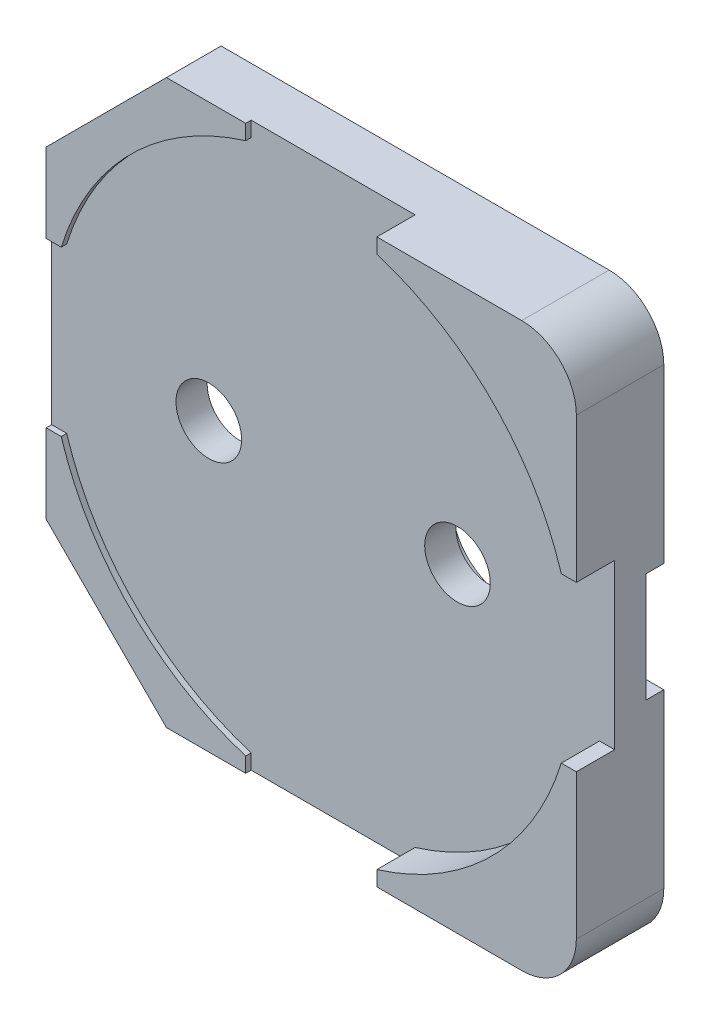
ISO-10303-21;
HEADER;
FILE_DESCRIPTION(('STEP AP214'),'2;1');
FILE_NAME('part.step','',(''),(''),'','','');
FILE_SCHEMA(('AUTOMOTIVE_DESIGN { 1 0 10303 214 1 1 1 1 }'));
ENDSEC;
DATA;
#1=APPLICATION_CONTEXT('core data for automotive mechanical design processes');
#2=APPLICATION_PROTOCOL_DEFINITION('international standard','automotive_design',2000,#1);
#3=PRODUCT_CONTEXT('',#1,'mechanical');
#4=PRODUCT('Part','Part','',(#3));
#5=PRODUCT_RELATED_PRODUCT_CATEGORY('part','',(#4));
#6=PRODUCT_DEFINITION_FORMATION('','',#4);
#7=PRODUCT_DEFINITION_CONTEXT('part definition',#1,'design');
#8=PRODUCT_DEFINITION('design','',#6,#7);
#9=PRODUCT_DEFINITION_SHAPE('','',#8);
#10=(LENGTH_UNIT() NAMED_UNIT(*) SI_UNIT(.MILLI.,.METRE.));
#11=(NAMED_UNIT(*) PLANE_ANGLE_UNIT() SI_UNIT($,.RADIAN.));
#12=(NAMED_UNIT(*) SI_UNIT($,.STERADIAN.) SOLID_ANGLE_UNIT());
#13=UNCERTAINTY_MEASURE_WITH_UNIT(LENGTH_MEASURE(1.E-05),#10,'distance_accuracy_value','');
#14=(GEOMETRIC_REPRESENTATION_CONTEXT(3) GLOBAL_UNCERTAINTY_ASSIGNED_CONTEXT((#13)) GLOBAL_UNIT_ASSIGNED_CONTEXT((#10,
#11,#12)) REPRESENTATION_CONTEXT('',''));
#15=CARTESIAN_POINT('',(0.,0.,0.));
#16=DIRECTION('',(0.,0.,1.));
#17=DIRECTION('',(1.,0.,0.));
#18=AXIS2_PLACEMENT_3D('',#15,#16,#17);
#19=CARTESIAN_POINT('',(0.,0.,-0.9));
#20=DIRECTION('',(0.,0.,-1.));
#21=DIRECTION('',(0.,-1.,0.));
#22=AXIS2_PLACEMENT_3D('',#19,#20,#21);
#23=PLANE('',#22);
#24=CARTESIAN_POINT('',(4.15,4.15,-0.9));
#25=DIRECTION('',(0.,0.,-1.));
#26=DIRECTION('',(0.,1.,0.));
#27=AXIS2_PLACEMENT_3D('',#24,#25,#26);
#28=CIRCLE('',#27,1.);
#29=CARTESIAN_POINT('',(4.15,5.15,-0.9));
#30=VERTEX_POINT('',#29);
#31=CARTESIAN_POINT('',(5.15,4.15,-0.9));
#32=VERTEX_POINT('',#31);
#33=EDGE_CURVE('E325',#30,#32,#28,.T.);
#34=ORIENTED_EDGE('',*,*,#33,.T.);
#35=DIRECTION('',(0.,-1.,0.));
#36=VECTOR('',#35,1.);
#37=CARTESIAN_POINT('',(5.15,0.,-0.9));
#38=LINE('',#37,#36);
#39=CARTESIAN_POINT('',(5.15,1.,-0.9));
#40=VERTEX_POINT('',#39);
#41=EDGE_CURVE('E28',#32,#40,#38,.T.);
#42=ORIENTED_EDGE('',*,*,#41,.T.);
#43=DIRECTION('',(-1.,0.,0.));
#44=VECTOR('',#43,1.);
#45=CARTESIAN_POINT('',(0.,1.,-0.9));
#46=LINE('',#45,#44);
#47=CARTESIAN_POINT('',(2.275,1.,-0.9));
#48=VERTEX_POINT('',#47);
#49=EDGE_CURVE('E590',#40,#48,#46,.T.);
#50=ORIENTED_EDGE('',*,*,#49,.T.);
#51=CARTESIAN_POINT('',(2.275,0.,-0.9));
#52=DIRECTION('',(0.,0.,1.));
#53=DIRECTION('',(0.,1.,0.));
#54=AXIS2_PLACEMENT_3D('',#51,#52,#53);
#55=CIRCLE('',#54,1.);
#56=CARTESIAN_POINT('',(2.275,-1.,-0.9));
#57=VERTEX_POINT('',#56);
#58=EDGE_CURVE('E436',#48,#57,#55,.T.);
#59=ORIENTED_EDGE('',*,*,#58,.T.);
#60=DIRECTION('',(1.,0.,0.));
#61=VECTOR('',#60,1.);
#62=CARTESIAN_POINT('',(0.,-1.,-0.9));
#63=LINE('',#62,#61);
#64=CARTESIAN_POINT('',(5.15,-1.,-0.9));
#65=VERTEX_POINT('',#64);
#66=EDGE_CURVE('E435',#57,#65,#63,.T.);
#67=ORIENTED_EDGE('',*,*,#66,.T.);
#68=DIRECTION('',(0.,-1.,0.));
#69=VECTOR('',#68,1.);
#70=CARTESIAN_POINT('',(5.15,0.,-0.9));
#71=LINE('',#70,#69);
#72=CARTESIAN_POINT('',(5.15,-4.15,-0.9));
#73=VERTEX_POINT('',#72);
#74=EDGE_CURVE('E11',#65,#73,#71,.T.);
#75=ORIENTED_EDGE('',*,*,#74,.T.);
#76=CARTESIAN_POINT('',(4.15,-4.15,-0.9));
#77=DIRECTION('',(0.,0.,-1.));
#78=DIRECTION('',(0.,1.,0.));
#79=AXIS2_PLACEMENT_3D('',#76,#77,#78);
#80=CIRCLE('',#79,1.);
#81=CARTESIAN_POINT('',(4.15,-5.15,-0.9));
#82=VERTEX_POINT('',#81);
#83=EDGE_CURVE('E499',#73,#82,#80,.T.);
#84=ORIENTED_EDGE('',*,*,#83,.T.);
#85=DIRECTION('',(-1.,0.,0.));
#86=VECTOR('',#85,1.);
#87=CARTESIAN_POINT('',(0.,-5.15,-0.9));
#88=LINE('',#87,#86);
#89=CARTESIAN_POINT('',(-2.95,-5.15,-0.9));
#90=VERTEX_POINT('',#89);
#91=EDGE_CURVE('E513',#82,#90,#88,.T.);
#92=ORIENTED_EDGE('',*,*,#91,.T.);
#93=DIRECTION('',(-0.707106781186548,0.707106781186548,0.));
#94=VECTOR('',#93,1.);
#95=CARTESIAN_POINT('',(-2.95,-5.15,-0.9));
#96=LINE('',#95,#94);
#97=CARTESIAN_POINT('',(-5.15,-2.95,-0.9));
#98=VERTEX_POINT('',#97);
#99=EDGE_CURVE('E466',#90,#98,#96,.T.);
#100=ORIENTED_EDGE('',*,*,#99,.T.);
#101=DIRECTION('',(0.,1.,0.));
#102=VECTOR('',#101,1.);
#103=CARTESIAN_POINT('',(-5.15,0.,-0.9));
#104=LINE('',#103,#102);
#105=CARTESIAN_POINT('',(-5.15,-1.,-0.9));
#106=VERTEX_POINT('',#105);
#107=EDGE_CURVE('E288',#98,#106,#104,.T.);
#108=ORIENTED_EDGE('',*,*,#107,.T.);
#109=DIRECTION('',(1.,0.,0.));
#110=VECTOR('',#109,1.);
#111=CARTESIAN_POINT('',(0.,-1.,-0.9));
#112=LINE('',#111,#110);
#113=CARTESIAN_POINT('',(-2.275,-1.,-0.9));
#114=VERTEX_POINT('',#113);
#115=EDGE_CURVE('E284',#106,#114,#112,.T.);
#116=ORIENTED_EDGE('',*,*,#115,.T.);
#117=CARTESIAN_POINT('',(-2.275,0.,-0.9));
#118=DIRECTION('',(0.,0.,1.));
#119=DIRECTION('',(0.,1.,0.));
#120=AXIS2_PLACEMENT_3D('',#117,#118,#119);
#121=CIRCLE('',#120,1.);
#122=CARTESIAN_POINT('',(-2.275,1.,-0.9));
#123=VERTEX_POINT('',#122);
#124=EDGE_CURVE('E271',#114,#123,#121,.T.);
#125=ORIENTED_EDGE('',*,*,#124,.T.);
#126=DIRECTION('',(-1.,0.,0.));
#127=VECTOR('',#126,1.);
#128=CARTESIAN_POINT('',(0.,1.,-0.9));
#129=LINE('',#128,#127);
#130=CARTESIAN_POINT('',(-5.15,1.,-0.9));
#131=VERTEX_POINT('',#130);
#132=EDGE_CURVE('E264',#123,#131,#129,.T.);
#133=ORIENTED_EDGE('',*,*,#132,.T.);
#134=DIRECTION('',(0.,1.,0.));
#135=VECTOR('',#134,1.);
#136=CARTESIAN_POINT('',(-5.15,0.,-0.9));
#137=LINE('',#136,#135);
#138=CARTESIAN_POINT('',(-5.15,2.95,-0.9));
#139=VERTEX_POINT('',#138);
#140=EDGE_CURVE('E423',#131,#139,#137,.T.);
#141=ORIENTED_EDGE('',*,*,#140,.T.);
#142=DIRECTION('',(0.707106781186548,0.707106781186548,0.));
#143=VECTOR('',#142,1.);
#144=CARTESIAN_POINT('',(-5.15,2.95,-0.9));
#145=LINE('',#144,#143);
#146=CARTESIAN_POINT('',(-2.95,5.15,-0.9));
#147=VERTEX_POINT('',#146);
#148=EDGE_CURVE('E311',#139,#147,#145,.T.);
#149=ORIENTED_EDGE('',*,*,#148,.T.);
#150=DIRECTION('',(1.,0.,0.));
#151=VECTOR('',#150,1.);
#152=CARTESIAN_POINT('',(0.,5.15,-0.9));
#153=LINE('',#152,#151);
#154=EDGE_CURVE('E321',#147,#30,#153,.T.);
#155=ORIENTED_EDGE('',*,*,#154,.T.);
#156=EDGE_LOOP('',(#34,#42,#50,#59,#67,#75,#84,#92,#100,#108,#116,#125,#133,#141,#149,#155));
#157=FACE_BOUND('',#156,.T.);
#158=ADVANCED_FACE('F17',(#157),#23,.T.);
#159=CARTESIAN_POINT('',(5.15,-5.15,-0.9));
#160=DIRECTION('',(1.,0.,0.));
#161=DIRECTION('',(0.,1.,0.));
#162=AXIS2_PLACEMENT_3D('',#159,#160,#161);
#163=PLANE('',#162);
#164=DIRECTION('',(0.,0.,1.));
#165=VECTOR('',#164,1.);
#166=CARTESIAN_POINT('',(5.15,-1.,-0.9));
#167=LINE('',#166,#165);
#168=CARTESIAN_POINT('',(5.15,-1.,-0.57));
#169=VERTEX_POINT('',#168);
#170=EDGE_CURVE('E88',#65,#169,#167,.T.);
#171=ORIENTED_EDGE('',*,*,#170,.T.);
#172=DIRECTION('',(0.,1.,0.));
#173=VECTOR('',#172,1.);
#174=CARTESIAN_POINT('',(5.15,-5.15,-0.57));
#175=LINE('',#174,#173);
#176=CARTESIAN_POINT('',(5.15,1.,-0.57));
#177=VERTEX_POINT('',#176);
#178=EDGE_CURVE('E521',#169,#177,#175,.T.);
#179=ORIENTED_EDGE('',*,*,#178,.T.);
#180=DIRECTION('',(0.,0.,-1.));
#181=VECTOR('',#180,1.);
#182=CARTESIAN_POINT('',(5.15,1.,-0.9));
#183=LINE('',#182,#181);
#184=EDGE_CURVE('E72',#177,#40,#183,.T.);
#185=ORIENTED_EDGE('',*,*,#184,.T.);
#186=ORIENTED_EDGE('',*,*,#41,.F.);
#187=DIRECTION('',(0.,0.,1.));
#188=VECTOR('',#187,1.);
#189=CARTESIAN_POINT('',(5.15,4.15,-0.9));
#190=LINE('',#189,#188);
#191=CARTESIAN_POINT('',(5.15,4.15,0.7));
#192=VERTEX_POINT('',#191);
#193=EDGE_CURVE('E346',#32,#192,#190,.T.);
#194=ORIENTED_EDGE('',*,*,#193,.T.);
#195=DIRECTION('',(0.,-1.,0.));
#196=VECTOR('',#195,1.);
#197=CARTESIAN_POINT('',(5.15,-5.15,0.7));
#198=LINE('',#197,#196);
#199=CARTESIAN_POINT('',(5.15,1.5,0.7));
#200=VERTEX_POINT('',#199);
#201=EDGE_CURVE('E354',#192,#200,#198,.T.);
#202=ORIENTED_EDGE('',*,*,#201,.T.);
#203=DIRECTION('',(0.,0.,-1.));
#204=VECTOR('',#203,1.);
#205=CARTESIAN_POINT('',(5.15,1.5,-0.9));
#206=LINE('',#205,#204);
#207=CARTESIAN_POINT('',(5.15,1.5,0.));
#208=VERTEX_POINT('',#207);
#209=EDGE_CURVE('E343',#200,#208,#206,.T.);
#210=ORIENTED_EDGE('',*,*,#209,.T.);
#211=DIRECTION('',(0.,-1.,0.));
#212=VECTOR('',#211,1.);
#213=CARTESIAN_POINT('',(5.15,-5.15,0.));
#214=LINE('',#213,#212);
#215=CARTESIAN_POINT('',(5.15,-1.5,0.));
#216=VERTEX_POINT('',#215);
#217=EDGE_CURVE('E342',#208,#216,#214,.T.);
#218=ORIENTED_EDGE('',*,*,#217,.T.);
#219=DIRECTION('',(0.,0.,1.));
#220=VECTOR('',#219,1.);
#221=CARTESIAN_POINT('',(5.15,-1.5,-0.9));
#222=LINE('',#221,#220);
#223=CARTESIAN_POINT('',(5.15,-1.5,0.7));
#224=VERTEX_POINT('',#223);
#225=EDGE_CURVE('E315',#216,#224,#222,.T.);
#226=ORIENTED_EDGE('',*,*,#225,.T.);
#227=DIRECTION('',(0.,-1.,0.));
#228=VECTOR('',#227,1.);
#229=CARTESIAN_POINT('',(5.15,-5.15,0.7));
#230=LINE('',#229,#228);
#231=CARTESIAN_POINT('',(5.15,-4.15,0.7));
#232=VERTEX_POINT('',#231);
#233=EDGE_CURVE('E538',#224,#232,#230,.T.);
#234=ORIENTED_EDGE('',*,*,#233,.T.);
#235=DIRECTION('',(0.,0.,-1.));
#236=VECTOR('',#235,1.);
#237=CARTESIAN_POINT('',(5.15,-4.15,-0.9));
#238=LINE('',#237,#236);
#239=EDGE_CURVE('E494',#232,#73,#238,.T.);
#240=ORIENTED_EDGE('',*,*,#239,.T.);
#241=ORIENTED_EDGE('',*,*,#74,.F.);
#242=EDGE_LOOP('',(#171,#179,#185,#186,#194,#202,#210,#218,#226,#234,#240,#241));
#243=FACE_BOUND('',#242,.T.);
#244=ADVANCED_FACE('F824',(#243),#163,.T.);
#245=CARTESIAN_POINT('',(4.15,4.15,-0.9));
#246=DIRECTION('',(0.,0.,1.));
#247=DIRECTION('',(0.,1.,0.));
#248=AXIS2_PLACEMENT_3D('',#245,#246,#247);
#249=CYLINDRICAL_SURFACE('',#248,1.);
#250=ORIENTED_EDGE('',*,*,#33,.F.);
#251=DIRECTION('',(0.,0.,1.));
#252=VECTOR('',#251,1.);
#253=CARTESIAN_POINT('',(4.15,5.15,-0.9));
#254=LINE('',#253,#252);
#255=CARTESIAN_POINT('',(4.15,5.15,0.7));
#256=VERTEX_POINT('',#255);
#257=EDGE_CURVE('E326',#30,#256,#254,.T.);
#258=ORIENTED_EDGE('',*,*,#257,.T.);
#259=CARTESIAN_POINT('',(4.15,4.15,0.7));
#260=DIRECTION('',(0.,0.,-1.));
#261=DIRECTION('',(0.,1.,0.));
#262=AXIS2_PLACEMENT_3D('',#259,#260,#261);
#263=CIRCLE('',#262,1.);
#264=EDGE_CURVE('E349',#256,#192,#263,.T.);
#265=ORIENTED_EDGE('',*,*,#264,.T.);
#266=ORIENTED_EDGE('',*,*,#193,.F.);
#267=EDGE_LOOP('',(#250,#258,#265,#266));
#268=FACE_BOUND('',#267,.T.);
#269=ADVANCED_FACE('F796',(#268),#249,.T.);
#270=CARTESIAN_POINT('',(5.15,5.15,-0.9));
#271=DIRECTION('',(0.,1.,0.));
#272=DIRECTION('',(1.,0.,0.));
#273=AXIS2_PLACEMENT_3D('',#270,#271,#272);
#274=PLANE('',#273);
#275=DIRECTION('',(0.,0.,1.));
#276=VECTOR('',#275,1.);
#277=CARTESIAN_POINT('',(1.5,5.15,-0.9));
#278=LINE('',#277,#276);
#279=CARTESIAN_POINT('',(1.5,5.15,0.));
#280=VERTEX_POINT('',#279);
#281=CARTESIAN_POINT('',(1.5,5.15,0.7));
#282=VERTEX_POINT('',#281);
#283=EDGE_CURVE('E597',#280,#282,#278,.T.);
#284=ORIENTED_EDGE('',*,*,#283,.T.);
#285=DIRECTION('',(1.,0.,0.));
#286=VECTOR('',#285,1.);
#287=CARTESIAN_POINT('',(5.15,5.15,0.7));
#288=LINE('',#287,#286);
#289=EDGE_CURVE('E353',#282,#256,#288,.T.);
#290=ORIENTED_EDGE('',*,*,#289,.T.);
#291=ORIENTED_EDGE('',*,*,#257,.F.);
#292=ORIENTED_EDGE('',*,*,#154,.F.);
#293=DIRECTION('',(0.,0.,1.));
#294=VECTOR('',#293,1.);
#295=CARTESIAN_POINT('',(-2.95,5.15,-0.9));
#296=LINE('',#295,#294);
#297=CARTESIAN_POINT('',(-2.95,5.15,0.09999999999998));
#298=VERTEX_POINT('',#297);
#299=EDGE_CURVE('E313',#147,#298,#296,.T.);
#300=ORIENTED_EDGE('',*,*,#299,.T.);
#301=DIRECTION('',(-1.,0.,0.));
#302=VECTOR('',#301,1.);
#303=CARTESIAN_POINT('',(-3.942363677304,5.15,0.09999999999998));
#304=LINE('',#303,#302);
#305=CARTESIAN_POINT('',(-1.5,5.15,0.09999999999998));
#306=VERTEX_POINT('',#305);
#307=EDGE_CURVE('E472',#306,#298,#304,.T.);
#308=ORIENTED_EDGE('',*,*,#307,.F.);
#309=DIRECTION('',(0.,0.,-1.));
#310=VECTOR('',#309,1.);
#311=CARTESIAN_POINT('',(-1.5,5.15,-0.9));
#312=LINE('',#311,#310);
#313=CARTESIAN_POINT('',(-1.5,5.15,0.));
#314=VERTEX_POINT('',#313);
#315=EDGE_CURVE('E548',#306,#314,#312,.T.);
#316=ORIENTED_EDGE('',*,*,#315,.T.);
#317=DIRECTION('',(1.,0.,0.));
#318=VECTOR('',#317,1.);
#319=CARTESIAN_POINT('',(5.15,5.15,0.));
#320=LINE('',#319,#318);
#321=EDGE_CURVE('E486',#314,#280,#320,.T.);
#322=ORIENTED_EDGE('',*,*,#321,.T.);
#323=EDGE_LOOP('',(#284,#290,#291,#292,#300,#308,#316,#322));
#324=FACE_BOUND('',#323,.T.);
#325=ADVANCED_FACE('F633',(#324),#274,.T.);
#326=CARTESIAN_POINT('',(-4.05,4.05,-0.9));
#327=DIRECTION('',(-0.707106781186548,0.707106781186548,0.));
#328=DIRECTION('',(0.,0.,1.));
#329=AXIS2_PLACEMENT_3D('',#326,#327,#328);
#330=PLANE('',#329);
#331=ORIENTED_EDGE('',*,*,#148,.F.);
#332=DIRECTION('',(0.,0.,1.));
#333=VECTOR('',#332,1.);
#334=CARTESIAN_POINT('',(-5.15,2.95,-0.9));
#335=LINE('',#334,#333);
#336=CARTESIAN_POINT('',(-5.15,2.95,0.09999999999999));
#337=VERTEX_POINT('',#336);
#338=EDGE_CURVE('E427',#139,#337,#335,.T.);
#339=ORIENTED_EDGE('',*,*,#338,.T.);
#340=DIRECTION('',(0.707106781186548,0.707106781186548,0.));
#341=VECTOR('',#340,1.);
#342=CARTESIAN_POINT('',(-4.05,4.05,0.09999999999999));
#343=LINE('',#342,#341);
#344=EDGE_CURVE('E462',#337,#298,#343,.T.);
#345=ORIENTED_EDGE('',*,*,#344,.T.);
#346=ORIENTED_EDGE('',*,*,#299,.F.);
#347=EDGE_LOOP('',(#331,#339,#345,#346));
#348=FACE_BOUND('',#347,.T.);
#349=ADVANCED_FACE('F621',(#348),#330,.T.);
#350=CARTESIAN_POINT('',(-5.15,5.15,-0.9));
#351=DIRECTION('',(-1.,0.,0.));
#352=DIRECTION('',(0.,1.,0.));
#353=AXIS2_PLACEMENT_3D('',#350,#351,#352);
#354=PLANE('',#353);
#355=ORIENTED_EDGE('',*,*,#338,.F.);
#356=ORIENTED_EDGE('',*,*,#140,.F.);
#357=DIRECTION('',(0.,0.,1.));
#358=VECTOR('',#357,1.);
#359=CARTESIAN_POINT('',(-5.15,1.,-0.9));
#360=LINE('',#359,#358);
#361=CARTESIAN_POINT('',(-5.15,1.,-0.57));
#362=VERTEX_POINT('',#361);
#363=EDGE_CURVE('E281',#131,#362,#360,.T.);
#364=ORIENTED_EDGE('',*,*,#363,.T.);
#365=DIRECTION('',(0.,-1.,0.));
#366=VECTOR('',#365,1.);
#367=CARTESIAN_POINT('',(-5.15,5.15,-0.57));
#368=LINE('',#367,#366);
#369=CARTESIAN_POINT('',(-5.15,-1.,-0.57));
#370=VERTEX_POINT('',#369);
#371=EDGE_CURVE('E471',#362,#370,#368,.T.);
#372=ORIENTED_EDGE('',*,*,#371,.T.);
#373=DIRECTION('',(0.,0.,-1.));
#374=VECTOR('',#373,1.);
#375=CARTESIAN_POINT('',(-5.15,-1.,-0.9));
#376=LINE('',#375,#374);
#377=EDGE_CURVE('E299',#370,#106,#376,.T.);
#378=ORIENTED_EDGE('',*,*,#377,.T.);
#379=ORIENTED_EDGE('',*,*,#107,.F.);
#380=DIRECTION('',(0.,0.,1.));
#381=VECTOR('',#380,1.);
#382=CARTESIAN_POINT('',(-5.15,-2.95,-0.9));
#383=LINE('',#382,#381);
#384=CARTESIAN_POINT('',(-5.15,-2.95,0.1));
#385=VERTEX_POINT('',#384);
#386=EDGE_CURVE('E305',#98,#385,#383,.T.);
#387=ORIENTED_EDGE('',*,*,#386,.T.);
#388=DIRECTION('',(0.,1.,0.));
#389=VECTOR('',#388,1.);
#390=CARTESIAN_POINT('',(-5.15,-3.942363677304,0.1));
#391=LINE('',#390,#389);
#392=CARTESIAN_POINT('',(-5.15,-1.5,0.1));
#393=VERTEX_POINT('',#392);
#394=EDGE_CURVE('E432',#385,#393,#391,.T.);
#395=ORIENTED_EDGE('',*,*,#394,.T.);
#396=DIRECTION('',(0.,0.,-1.));
#397=VECTOR('',#396,1.);
#398=CARTESIAN_POINT('',(-5.15,-1.5,-0.9));
#399=LINE('',#398,#397);
#400=CARTESIAN_POINT('',(-5.15,-1.5,0.));
#401=VERTEX_POINT('',#400);
#402=EDGE_CURVE('E332',#393,#401,#399,.T.);
#403=ORIENTED_EDGE('',*,*,#402,.T.);
#404=DIRECTION('',(0.,1.,0.));
#405=VECTOR('',#404,1.);
#406=CARTESIAN_POINT('',(-5.15,5.15,0.));
#407=LINE('',#406,#405);
#408=CARTESIAN_POINT('',(-5.15,1.5,0.));
#409=VERTEX_POINT('',#408);
#410=EDGE_CURVE('E483',#401,#409,#407,.T.);
#411=ORIENTED_EDGE('',*,*,#410,.T.);
#412=DIRECTION('',(0.,0.,1.));
#413=VECTOR('',#412,1.);
#414=CARTESIAN_POINT('',(-5.15,1.5,-0.9));
#415=LINE('',#414,#413);
#416=CARTESIAN_POINT('',(-5.15,1.5,0.1));
#417=VERTEX_POINT('',#416);
#418=EDGE_CURVE('E327',#409,#417,#415,.T.);
#419=ORIENTED_EDGE('',*,*,#418,.T.);
#420=DIRECTION('',(0.,1.,0.));
#421=VECTOR('',#420,1.);
#422=CARTESIAN_POINT('',(-5.15,5.15,0.09999999999998));
#423=LINE('',#422,#421);
#424=EDGE_CURVE('E457',#417,#337,#423,.T.);
#425=ORIENTED_EDGE('',*,*,#424,.T.);
#426=EDGE_LOOP('',(#355,#356,#364,#372,#378,#379,#387,#395,#403,#411,#419,#425));
#427=FACE_BOUND('',#426,.T.);
#428=ADVANCED_FACE('F625',(#427),#354,.T.);
#429=CARTESIAN_POINT('',(-2.275,1.,-0.9));
#430=DIRECTION('',(0.,1.,0.));
#431=DIRECTION('',(1.,0.,0.));
#432=AXIS2_PLACEMENT_3D('',#429,#430,#431);
#433=PLANE('',#432);
#434=DIRECTION('',(0.,0.,-1.));
#435=VECTOR('',#434,1.);
#436=CARTESIAN_POINT('',(-2.275,1.,-0.9));
#437=LINE('',#436,#435);
#438=CARTESIAN_POINT('',(-2.275,1.,-0.57));
#439=VERTEX_POINT('',#438);
#440=EDGE_CURVE('E278',#439,#123,#437,.T.);
#441=ORIENTED_EDGE('',*,*,#440,.F.);
#442=DIRECTION('',(1.,0.,0.));
#443=VECTOR('',#442,1.);
#444=CARTESIAN_POINT('',(-2.275,1.,-0.57));
#445=LINE('',#444,#443);
#446=EDGE_CURVE('E467',#362,#439,#445,.T.);
#447=ORIENTED_EDGE('',*,*,#446,.F.);
#448=ORIENTED_EDGE('',*,*,#363,.F.);
#449=ORIENTED_EDGE('',*,*,#132,.F.);
#450=EDGE_LOOP('',(#441,#447,#448,#449));
#451=FACE_BOUND('',#450,.T.);
#452=ADVANCED_FACE('F799',(#451),#433,.F.);
#453=CARTESIAN_POINT('',(-2.275,0.,-0.9));
#454=DIRECTION('',(0.,0.,1.));
#455=DIRECTION('',(0.,1.,0.));
#456=AXIS2_PLACEMENT_3D('',#453,#454,#455);
#457=CYLINDRICAL_SURFACE('',#456,1.);
#458=CARTESIAN_POINT('',(-2.275,0.,-0.57));
#459=DIRECTION('',(0.,0.,-1.));
#460=DIRECTION('',(0.,1.,0.));
#461=AXIS2_PLACEMENT_3D('',#458,#459,#460);
#462=CIRCLE('',#461,1.);
#463=CARTESIAN_POINT('',(-2.275,-1.,-0.57));
#464=VERTEX_POINT('',#463);
#465=EDGE_CURVE('E374',#439,#464,#462,.T.);
#466=ORIENTED_EDGE('',*,*,#465,.F.);
#467=ORIENTED_EDGE('',*,*,#440,.T.);
#468=ORIENTED_EDGE('',*,*,#124,.F.);
#469=DIRECTION('',(0.,0.,-1.));
#470=VECTOR('',#469,1.);
#471=CARTESIAN_POINT('',(-2.275,-1.,-0.9));
#472=LINE('',#471,#470);
#473=EDGE_CURVE('E276',#464,#114,#472,.T.);
#474=ORIENTED_EDGE('',*,*,#473,.F.);
#475=EDGE_LOOP('',(#466,#467,#468,#474));
#476=FACE_BOUND('',#475,.T.);
#477=ADVANCED_FACE('F274',(#476),#457,.F.);
#478=CARTESIAN_POINT('',(-5.15,-1.,-0.9));
#479=DIRECTION('',(0.,-1.,0.));
#480=DIRECTION('',(0.,0.,-1.));
#481=AXIS2_PLACEMENT_3D('',#478,#479,#480);
#482=PLANE('',#481);
#483=ORIENTED_EDGE('',*,*,#377,.F.);
#484=DIRECTION('',(-1.,0.,0.));
#485=VECTOR('',#484,1.);
#486=CARTESIAN_POINT('',(-5.15,-1.,-0.57));
#487=LINE('',#486,#485);
#488=EDGE_CURVE('E296',#464,#370,#487,.T.);
#489=ORIENTED_EDGE('',*,*,#488,.F.);
#490=ORIENTED_EDGE('',*,*,#473,.T.);
#491=ORIENTED_EDGE('',*,*,#115,.F.);
#492=EDGE_LOOP('',(#483,#489,#490,#491));
#493=FACE_BOUND('',#492,.T.);
#494=ADVANCED_FACE('F294',(#493),#482,.F.);
#495=CARTESIAN_POINT('',(-4.05,-4.05,-0.9));
#496=DIRECTION('',(-0.707106781186548,-0.707106781186548,0.));
#497=DIRECTION('',(-0.707106781186548,0.707106781186548,0.));
#498=AXIS2_PLACEMENT_3D('',#495,#496,#497);
#499=PLANE('',#498);
#500=ORIENTED_EDGE('',*,*,#99,.F.);
#501=DIRECTION('',(0.,0.,1.));
#502=VECTOR('',#501,1.);
#503=CARTESIAN_POINT('',(-2.95,-5.15,-0.9));
#504=LINE('',#503,#502);
#505=CARTESIAN_POINT('',(-2.95,-5.15,0.1));
#506=VERTEX_POINT('',#505);
#507=EDGE_CURVE('E510',#90,#506,#504,.T.);
#508=ORIENTED_EDGE('',*,*,#507,.T.);
#509=DIRECTION('',(-0.707106781186548,0.707106781186548,0.));
#510=VECTOR('',#509,1.);
#511=CARTESIAN_POINT('',(-4.05,-4.05,0.1));
#512=LINE('',#511,#510);
#513=EDGE_CURVE('E568',#506,#385,#512,.T.);
#514=ORIENTED_EDGE('',*,*,#513,.T.);
#515=ORIENTED_EDGE('',*,*,#386,.F.);
#516=EDGE_LOOP('',(#500,#508,#514,#515));
#517=FACE_BOUND('',#516,.T.);
#518=ADVANCED_FACE('F708',(#517),#499,.T.);
#519=CARTESIAN_POINT('',(-5.15,-5.15,-0.9));
#520=DIRECTION('',(0.,-1.,0.));
#521=DIRECTION('',(0.,0.,-1.));
#522=AXIS2_PLACEMENT_3D('',#519,#520,#521);
#523=PLANE('',#522);
#524=ORIENTED_EDGE('',*,*,#507,.F.);
#525=ORIENTED_EDGE('',*,*,#91,.F.);
#526=DIRECTION('',(0.,0.,1.));
#527=VECTOR('',#526,1.);
#528=CARTESIAN_POINT('',(4.15,-5.15,-0.9));
#529=LINE('',#528,#527);
#530=CARTESIAN_POINT('',(4.15,-5.15,0.7));
#531=VERTEX_POINT('',#530);
#532=EDGE_CURVE('E498',#82,#531,#529,.T.);
#533=ORIENTED_EDGE('',*,*,#532,.T.);
#534=DIRECTION('',(-1.,0.,0.));
#535=VECTOR('',#534,1.);
#536=CARTESIAN_POINT('',(-5.15,-5.15,0.7));
#537=LINE('',#536,#535);
#538=CARTESIAN_POINT('',(1.5,-5.15,0.7));
#539=VERTEX_POINT('',#538);
#540=EDGE_CURVE('E319',#531,#539,#537,.T.);
#541=ORIENTED_EDGE('',*,*,#540,.T.);
#542=DIRECTION('',(0.,0.,-1.));
#543=VECTOR('',#542,1.);
#544=CARTESIAN_POINT('',(1.5,-5.15,-0.9));
#545=LINE('',#544,#543);
#546=CARTESIAN_POINT('',(1.5,-5.15,0.));
#547=VERTEX_POINT('',#546);
#548=EDGE_CURVE('E309',#539,#547,#545,.T.);
#549=ORIENTED_EDGE('',*,*,#548,.T.);
#550=DIRECTION('',(-1.,0.,0.));
#551=VECTOR('',#550,1.);
#552=CARTESIAN_POINT('',(-5.15,-5.15,0.));
#553=LINE('',#552,#551);
#554=CARTESIAN_POINT('',(-1.5,-5.15,0.));
#555=VERTEX_POINT('',#554);
#556=EDGE_CURVE('E485',#547,#555,#553,.T.);
#557=ORIENTED_EDGE('',*,*,#556,.T.);
#558=DIRECTION('',(0.,0.,1.));
#559=VECTOR('',#558,1.);
#560=CARTESIAN_POINT('',(-1.5,-5.15,-0.9));
#561=LINE('',#560,#559);
#562=CARTESIAN_POINT('',(-1.5,-5.15,0.1));
#563=VERTEX_POINT('',#562);
#564=EDGE_CURVE('E399',#555,#563,#561,.T.);
#565=ORIENTED_EDGE('',*,*,#564,.T.);
#566=DIRECTION('',(-1.,0.,0.));
#567=VECTOR('',#566,1.);
#568=CARTESIAN_POINT('',(-5.15,-5.15,0.1));
#569=LINE('',#568,#567);
#570=EDGE_CURVE('E421',#563,#506,#569,.T.);
#571=ORIENTED_EDGE('',*,*,#570,.T.);
#572=EDGE_LOOP('',(#524,#525,#533,#541,#549,#557,#565,#571));
#573=FACE_BOUND('',#572,.T.);
#574=ADVANCED_FACE('F712',(#573),#523,.T.);
#575=CARTESIAN_POINT('',(4.15,-4.15,-0.9));
#576=DIRECTION('',(0.,0.,1.));
#577=DIRECTION('',(0.,1.,0.));
#578=AXIS2_PLACEMENT_3D('',#575,#576,#577);
#579=CYLINDRICAL_SURFACE('',#578,1.);
#580=ORIENTED_EDGE('',*,*,#83,.F.);
#581=ORIENTED_EDGE('',*,*,#239,.F.);
#582=CARTESIAN_POINT('',(4.15,-4.15,0.7));
#583=DIRECTION('',(0.,0.,-1.));
#584=DIRECTION('',(0.,1.,0.));
#585=AXIS2_PLACEMENT_3D('',#582,#583,#584);
#586=CIRCLE('',#585,1.);
#587=EDGE_CURVE('E506',#232,#531,#586,.T.);
#588=ORIENTED_EDGE('',*,*,#587,.T.);
#589=ORIENTED_EDGE('',*,*,#532,.F.);
#590=EDGE_LOOP('',(#580,#581,#588,#589));
#591=FACE_BOUND('',#590,.T.);
#592=ADVANCED_FACE('F840',(#591),#579,.T.);
#593=CARTESIAN_POINT('',(2.275,-1.,-0.9));
#594=DIRECTION('',(0.,-1.,0.));
#595=DIRECTION('',(0.,0.,-1.));
#596=AXIS2_PLACEMENT_3D('',#593,#594,#595);
#597=PLANE('',#596);
#598=DIRECTION('',(0.,0.,-1.));
#599=VECTOR('',#598,1.);
#600=CARTESIAN_POINT('',(2.275,-1.,-0.9));
#601=LINE('',#600,#599);
#602=CARTESIAN_POINT('',(2.275,-1.,-0.57));
#603=VERTEX_POINT('',#602);
#604=EDGE_CURVE('E516',#603,#57,#601,.T.);
#605=ORIENTED_EDGE('',*,*,#604,.F.);
#606=DIRECTION('',(-1.,0.,0.));
#607=VECTOR('',#606,1.);
#608=CARTESIAN_POINT('',(2.275,-1.,-0.57));
#609=LINE('',#608,#607);
#610=EDGE_CURVE('E410',#169,#603,#609,.T.);
#611=ORIENTED_EDGE('',*,*,#610,.F.);
#612=ORIENTED_EDGE('',*,*,#170,.F.);
#613=ORIENTED_EDGE('',*,*,#66,.F.);
#614=EDGE_LOOP('',(#605,#611,#612,#613));
#615=FACE_BOUND('',#614,.T.);
#616=ADVANCED_FACE('F837',(#615),#597,.F.);
#617=CARTESIAN_POINT('',(2.275,0.,-0.9));
#618=DIRECTION('',(0.,0.,1.));
#619=DIRECTION('',(0.,1.,0.));
#620=AXIS2_PLACEMENT_3D('',#617,#618,#619);
#621=CYLINDRICAL_SURFACE('',#620,1.);
#622=CARTESIAN_POINT('',(2.275,0.,-0.57));
#623=DIRECTION('',(0.,0.,-1.));
#624=DIRECTION('',(0.,1.,0.));
#625=AXIS2_PLACEMENT_3D('',#622,#623,#624);
#626=CIRCLE('',#625,1.);
#627=CARTESIAN_POINT('',(2.275,1.,-0.57));
#628=VERTEX_POINT('',#627);
#629=EDGE_CURVE('E406',#603,#628,#626,.T.);
#630=ORIENTED_EDGE('',*,*,#629,.F.);
#631=ORIENTED_EDGE('',*,*,#604,.T.);
#632=ORIENTED_EDGE('',*,*,#58,.F.);
#633=DIRECTION('',(0.,0.,-1.));
#634=VECTOR('',#633,1.);
#635=CARTESIAN_POINT('',(2.275,1.,-0.9));
#636=LINE('',#635,#634);
#637=EDGE_CURVE('E479',#628,#48,#636,.T.);
#638=ORIENTED_EDGE('',*,*,#637,.F.);
#639=EDGE_LOOP('',(#630,#631,#632,#638));
#640=FACE_BOUND('',#639,.T.);
#641=ADVANCED_FACE('F839',(#640),#621,.F.);
#642=CARTESIAN_POINT('',(5.15,1.,-0.9));
#643=DIRECTION('',(0.,1.,0.));
#644=DIRECTION('',(1.,0.,0.));
#645=AXIS2_PLACEMENT_3D('',#642,#643,#644);
#646=PLANE('',#645);
#647=ORIENTED_EDGE('',*,*,#184,.F.);
#648=DIRECTION('',(1.,0.,0.));
#649=VECTOR('',#648,1.);
#650=CARTESIAN_POINT('',(5.15,1.,-0.57));
#651=LINE('',#650,#649);
#652=EDGE_CURVE('E21',#628,#177,#651,.T.);
#653=ORIENTED_EDGE('',*,*,#652,.F.);
#654=ORIENTED_EDGE('',*,*,#637,.T.);
#655=ORIENTED_EDGE('',*,*,#49,.F.);
#656=EDGE_LOOP('',(#647,#653,#654,#655));
#657=FACE_BOUND('',#656,.T.);
#658=ADVANCED_FACE('F847',(#657),#646,.F.);
#659=CARTESIAN_POINT('',(2.275,0.,-0.57));
#660=DIRECTION('',(0.,0.,-1.));
#661=DIRECTION('',(0.,-1.,0.));
#662=AXIS2_PLACEMENT_3D('',#659,#660,#661);
#663=PLANE('',#662);
#664=ORIENTED_EDGE('',*,*,#178,.F.);
#665=ORIENTED_EDGE('',*,*,#610,.T.);
#666=ORIENTED_EDGE('',*,*,#629,.T.);
#667=ORIENTED_EDGE('',*,*,#652,.T.);
#668=EDGE_LOOP('',(#664,#665,#666,#667));
#669=FACE_BOUND('',#668,.T.);
#670=CARTESIAN_POINT('',(2.275,0.,-0.57));
#671=DIRECTION('',(0.,0.,1.));
#672=DIRECTION('',(0.,1.,0.));
#673=AXIS2_PLACEMENT_3D('',#670,#671,#672);
#674=CIRCLE('',#673,0.6);
#675=CARTESIAN_POINT('',(2.275,0.6,-0.57));
#676=VERTEX_POINT('',#675);
#677=EDGE_CURVE('E361',#676,#676,#674,.T.);
#678=ORIENTED_EDGE('',*,*,#677,.T.);
#679=EDGE_LOOP('',(#678));
#680=FACE_BOUND('',#679,.T.);
#681=ADVANCED_FACE('F854',(#669,#680),#663,.T.);
#682=CARTESIAN_POINT('',(0.,0.,0.7));
#683=DIRECTION('',(0.,0.,1.));
#684=DIRECTION('',(0.,-1.,0.));
#685=AXIS2_PLACEMENT_3D('',#682,#683,#684);
#686=PLANE('',#685);
#687=DIRECTION('',(0.,-1.,0.));
#688=VECTOR('',#687,1.);
#689=CARTESIAN_POINT('',(1.5,0.,0.7));
#690=LINE('',#689,#688);
#691=CARTESIAN_POINT('',(1.5,-4.874423042782,0.7));
#692=VERTEX_POINT('',#691);
#693=EDGE_CURVE('E395',#692,#539,#690,.T.);
#694=ORIENTED_EDGE('',*,*,#693,.T.);
#695=ORIENTED_EDGE('',*,*,#540,.F.);
#696=ORIENTED_EDGE('',*,*,#587,.F.);
#697=ORIENTED_EDGE('',*,*,#233,.F.);
#698=DIRECTION('',(-1.,0.,0.));
#699=VECTOR('',#698,1.);
#700=CARTESIAN_POINT('',(0.,-1.5,0.7));
#701=LINE('',#700,#699);
#702=CARTESIAN_POINT('',(4.874423042782,-1.5,0.7));
#703=VERTEX_POINT('',#702);
#704=EDGE_CURVE('E320',#224,#703,#701,.T.);
#705=ORIENTED_EDGE('',*,*,#704,.T.);
#706=CARTESIAN_POINT('',(0.,0.,0.7));
#707=DIRECTION('',(0.,0.,-1.));
#708=DIRECTION('',(0.,-1.,0.));
#709=AXIS2_PLACEMENT_3D('',#706,#707,#708);
#710=CIRCLE('',#709,5.1);
#711=EDGE_CURVE('E400',#703,#692,#710,.T.);
#712=ORIENTED_EDGE('',*,*,#711,.T.);
#713=EDGE_LOOP('',(#694,#695,#696,#697,#705,#712));
#714=FACE_BOUND('',#713,.T.);
#715=ADVANCED_FACE('F762',(#714),#686,.T.);
#716=CARTESIAN_POINT('',(5.15,-1.5,0.7));
#717=DIRECTION('',(0.,-1.,0.));
#718=DIRECTION('',(0.,0.,-1.));
#719=AXIS2_PLACEMENT_3D('',#716,#717,#718);
#720=PLANE('',#719);
#721=ORIENTED_EDGE('',*,*,#704,.F.);
#722=ORIENTED_EDGE('',*,*,#225,.F.);
#723=DIRECTION('',(1.,0.,0.));
#724=VECTOR('',#723,1.);
#725=CARTESIAN_POINT('',(5.15,-1.5,0.));
#726=LINE('',#725,#724);
#727=CARTESIAN_POINT('',(4.874423042782,-1.5,0.));
#728=VERTEX_POINT('',#727);
#729=EDGE_CURVE('E338',#728,#216,#726,.T.);
#730=ORIENTED_EDGE('',*,*,#729,.F.);
#731=DIRECTION('',(0.,0.,-1.));
#732=VECTOR('',#731,1.);
#733=CARTESIAN_POINT('',(4.874423042782,-1.5,0.7));
#734=LINE('',#733,#732);
#735=EDGE_CURVE('E404',#703,#728,#734,.T.);
#736=ORIENTED_EDGE('',*,*,#735,.F.);
#737=EDGE_LOOP('',(#721,#722,#730,#736));
#738=FACE_BOUND('',#737,.T.);
#739=ADVANCED_FACE('F767',(#738),#720,.F.);
#740=CARTESIAN_POINT('',(0.,0.,0.));
#741=DIRECTION('',(0.,0.,-1.));
#742=DIRECTION('',(0.,-1.,0.));
#743=AXIS2_PLACEMENT_3D('',#740,#741,#742);
#744=PLANE('',#743);
#745=CARTESIAN_POINT('',(0.,0.,0.));
#746=DIRECTION('',(0.,0.,-1.));
#747=DIRECTION('',(0.,-1.,0.));
#748=AXIS2_PLACEMENT_3D('',#745,#746,#747);
#749=CIRCLE('',#748,5.1);
#750=CARTESIAN_POINT('',(1.5,-4.874423042782,0.));
#751=VERTEX_POINT('',#750);
#752=EDGE_CURVE('E525',#728,#751,#749,.T.);
#753=ORIENTED_EDGE('',*,*,#752,.F.);
#754=ORIENTED_EDGE('',*,*,#729,.T.);
#755=ORIENTED_EDGE('',*,*,#217,.F.);
#756=DIRECTION('',(1.,0.,0.));
#757=VECTOR('',#756,1.);
#758=CARTESIAN_POINT('',(0.,1.5,0.));
#759=LINE('',#758,#757);
#760=CARTESIAN_POINT('',(4.874423042782,1.5,0.));
#761=VERTEX_POINT('',#760);
#762=EDGE_CURVE('E452',#761,#208,#759,.T.);
#763=ORIENTED_EDGE('',*,*,#762,.F.);
#764=CARTESIAN_POINT('',(0.,0.,0.));
#765=DIRECTION('',(0.,0.,-1.));
#766=DIRECTION('',(0.,-1.,0.));
#767=AXIS2_PLACEMENT_3D('',#764,#765,#766);
#768=CIRCLE('',#767,5.1);
#769=CARTESIAN_POINT('',(1.5,4.874423042782,0.));
#770=VERTEX_POINT('',#769);
#771=EDGE_CURVE('E411',#770,#761,#768,.T.);
#772=ORIENTED_EDGE('',*,*,#771,.F.);
#773=DIRECTION('',(0.,-1.,0.));
#774=VECTOR('',#773,1.);
#775=CARTESIAN_POINT('',(1.5,0.,0.));
#776=LINE('',#775,#774);
#777=EDGE_CURVE('E381',#280,#770,#776,.T.);
#778=ORIENTED_EDGE('',*,*,#777,.F.);
#779=ORIENTED_EDGE('',*,*,#321,.F.);
#780=DIRECTION('',(0.,1.,0.));
#781=VECTOR('',#780,1.);
#782=CARTESIAN_POINT('',(-1.5,0.,0.));
#783=LINE('',#782,#781);
#784=CARTESIAN_POINT('',(-1.5,4.874423042782,0.));
#785=VERTEX_POINT('',#784);
#786=EDGE_CURVE('E461',#785,#314,#783,.T.);
#787=ORIENTED_EDGE('',*,*,#786,.F.);
#788=CARTESIAN_POINT('',(0.,0.,0.));
#789=DIRECTION('',(0.,0.,-1.));
#790=DIRECTION('',(0.,-1.,0.));
#791=AXIS2_PLACEMENT_3D('',#788,#789,#790);
#792=CIRCLE('',#791,5.1);
#793=CARTESIAN_POINT('',(-4.874423042782,1.5,0.));
#794=VERTEX_POINT('',#793);
#795=EDGE_CURVE('E383',#794,#785,#792,.T.);
#796=ORIENTED_EDGE('',*,*,#795,.F.);
#797=DIRECTION('',(1.,0.,0.));
#798=VECTOR('',#797,1.);
#799=CARTESIAN_POINT('',(0.,1.5,0.));
#800=LINE('',#799,#798);
#801=EDGE_CURVE('E331',#409,#794,#800,.T.);
#802=ORIENTED_EDGE('',*,*,#801,.F.);
#803=ORIENTED_EDGE('',*,*,#410,.F.);
#804=DIRECTION('',(-1.,0.,0.));
#805=VECTOR('',#804,1.);
#806=CARTESIAN_POINT('',(0.,-1.5,0.));
#807=LINE('',#806,#805);
#808=CARTESIAN_POINT('',(-4.874423042782,-1.5,0.));
#809=VERTEX_POINT('',#808);
#810=EDGE_CURVE('E373',#809,#401,#807,.T.);
#811=ORIENTED_EDGE('',*,*,#810,.F.);
#812=CARTESIAN_POINT('',(0.,0.,0.));
#813=DIRECTION('',(0.,0.,-1.));
#814=DIRECTION('',(0.,-1.,0.));
#815=AXIS2_PLACEMENT_3D('',#812,#813,#814);
#816=CIRCLE('',#815,5.1);
#817=CARTESIAN_POINT('',(-1.5,-4.874423042782,0.));
#818=VERTEX_POINT('',#817);
#819=EDGE_CURVE('E370',#818,#809,#816,.T.);
#820=ORIENTED_EDGE('',*,*,#819,.F.);
#821=DIRECTION('',(0.,1.,0.));
#822=VECTOR('',#821,1.);
#823=CARTESIAN_POINT('',(-1.5,0.,0.));
#824=LINE('',#823,#822);
#825=EDGE_CURVE('E422',#555,#818,#824,.T.);
#826=ORIENTED_EDGE('',*,*,#825,.F.);
#827=ORIENTED_EDGE('',*,*,#556,.F.);
#828=DIRECTION('',(0.,-1.,0.));
#829=VECTOR('',#828,1.);
#830=CARTESIAN_POINT('',(1.5,0.,0.));
#831=LINE('',#830,#829);
#832=EDGE_CURVE('E333',#751,#547,#831,.T.);
#833=ORIENTED_EDGE('',*,*,#832,.F.);
#834=EDGE_LOOP('',(#753,#754,#755,#763,#772,#778,#779,#787,#796,#802,#803,#811,#820,#826,#827,#833));
#835=FACE_BOUND('',#834,.T.);
#836=CARTESIAN_POINT('',(2.275,0.,0.));
#837=DIRECTION('',(0.,0.,1.));
#838=DIRECTION('',(0.,1.,0.));
#839=AXIS2_PLACEMENT_3D('',#836,#837,#838);
#840=CIRCLE('',#839,0.6);
#841=CARTESIAN_POINT('',(2.275,0.6,0.));
#842=VERTEX_POINT('',#841);
#843=EDGE_CURVE('E337',#842,#842,#840,.T.);
#844=ORIENTED_EDGE('',*,*,#843,.F.);
#845=EDGE_LOOP('',(#844));
#846=FACE_BOUND('',#845,.T.);
#847=CARTESIAN_POINT('',(-2.275,0.,0.));
#848=DIRECTION('',(0.,0.,1.));
#849=DIRECTION('',(0.,1.,0.));
#850=AXIS2_PLACEMENT_3D('',#847,#848,#849);
#851=CIRCLE('',#850,0.6);
#852=CARTESIAN_POINT('',(-2.275,0.6,0.));
#853=VERTEX_POINT('',#852);
#854=EDGE_CURVE('E405',#853,#853,#851,.T.);
#855=ORIENTED_EDGE('',*,*,#854,.F.);
#856=EDGE_LOOP('',(#855));
#857=FACE_BOUND('',#856,.T.);
#858=ADVANCED_FACE('F695',(#835,#846,#857),#744,.F.);
#859=CARTESIAN_POINT('',(-5.15,1.5,0.7));
#860=DIRECTION('',(0.,1.,0.));
#861=DIRECTION('',(1.,0.,0.));
#862=AXIS2_PLACEMENT_3D('',#859,#860,#861);
#863=PLANE('',#862);
#864=ORIENTED_EDGE('',*,*,#762,.T.);
#865=ORIENTED_EDGE('',*,*,#209,.F.);
#866=DIRECTION('',(1.,0.,0.));
#867=VECTOR('',#866,1.);
#868=CARTESIAN_POINT('',(-5.15,1.5,0.7));
#869=LINE('',#868,#867);
#870=CARTESIAN_POINT('',(4.874423042782,1.5,0.7));
#871=VERTEX_POINT('',#870);
#872=EDGE_CURVE('E378',#871,#200,#869,.T.);
#873=ORIENTED_EDGE('',*,*,#872,.F.);
#874=DIRECTION('',(0.,0.,1.));
#875=VECTOR('',#874,1.);
#876=CARTESIAN_POINT('',(4.874423042782,1.5,0.7));
#877=LINE('',#876,#875);
#878=EDGE_CURVE('E415',#761,#871,#877,.T.);
#879=ORIENTED_EDGE('',*,*,#878,.F.);
#880=EDGE_LOOP('',(#864,#865,#873,#879));
#881=FACE_BOUND('',#880,.T.);
#882=ADVANCED_FACE('F19',(#881),#863,.F.);
#883=CARTESIAN_POINT('',(0.,0.,0.7));
#884=DIRECTION('',(0.,0.,1.));
#885=DIRECTION('',(0.,-1.,0.));
#886=AXIS2_PLACEMENT_3D('',#883,#884,#885);
#887=PLANE('',#886);
#888=ORIENTED_EDGE('',*,*,#872,.T.);
#889=ORIENTED_EDGE('',*,*,#201,.F.);
#890=ORIENTED_EDGE('',*,*,#264,.F.);
#891=ORIENTED_EDGE('',*,*,#289,.F.);
#892=DIRECTION('',(0.,-1.,0.));
#893=VECTOR('',#892,1.);
#894=CARTESIAN_POINT('',(1.5,0.,0.7));
#895=LINE('',#894,#893);
#896=CARTESIAN_POINT('',(1.5,4.874423042782,0.7));
#897=VERTEX_POINT('',#896);
#898=EDGE_CURVE('E552',#282,#897,#895,.T.);
#899=ORIENTED_EDGE('',*,*,#898,.T.);
#900=CARTESIAN_POINT('',(0.,0.,0.7));
#901=DIRECTION('',(0.,0.,-1.));
#902=DIRECTION('',(0.,-1.,0.));
#903=AXIS2_PLACEMENT_3D('',#900,#901,#902);
#904=CIRCLE('',#903,5.1);
#905=EDGE_CURVE('E394',#897,#871,#904,.T.);
#906=ORIENTED_EDGE('',*,*,#905,.T.);
#907=EDGE_LOOP('',(#888,#889,#890,#891,#899,#906));
#908=FACE_BOUND('',#907,.T.);
#909=ADVANCED_FACE('F794',(#908),#887,.T.);
#910=CARTESIAN_POINT('',(1.5,5.15,0.7));
#911=DIRECTION('',(1.,0.,0.));
#912=DIRECTION('',(0.,1.,0.));
#913=AXIS2_PLACEMENT_3D('',#910,#911,#912);
#914=PLANE('',#913);
#915=ORIENTED_EDGE('',*,*,#898,.F.);
#916=ORIENTED_EDGE('',*,*,#283,.F.);
#917=ORIENTED_EDGE('',*,*,#777,.T.);
#918=DIRECTION('',(0.,0.,-1.));
#919=VECTOR('',#918,1.);
#920=CARTESIAN_POINT('',(1.5,4.874423042782,0.7));
#921=LINE('',#920,#919);
#922=EDGE_CURVE('E389',#897,#770,#921,.T.);
#923=ORIENTED_EDGE('',*,*,#922,.F.);
#924=EDGE_LOOP('',(#915,#916,#917,#923));
#925=FACE_BOUND('',#924,.T.);
#926=ADVANCED_FACE('F791',(#925),#914,.F.);
#927=CARTESIAN_POINT('',(-1.5,-5.15,0.7));
#928=DIRECTION('',(-1.,0.,0.));
#929=DIRECTION('',(0.,1.,0.));
#930=AXIS2_PLACEMENT_3D('',#927,#928,#929);
#931=PLANE('',#930);
#932=DIRECTION('',(0.,0.,1.));
#933=VECTOR('',#932,1.);
#934=CARTESIAN_POINT('',(-1.5,4.874423042782,0.7));
#935=LINE('',#934,#933);
#936=CARTESIAN_POINT('',(-1.5,4.874423042782,0.09999999999998));
#937=VERTEX_POINT('',#936);
#938=EDGE_CURVE('E387',#785,#937,#935,.T.);
#939=ORIENTED_EDGE('',*,*,#938,.F.);
#940=ORIENTED_EDGE('',*,*,#786,.T.);
#941=ORIENTED_EDGE('',*,*,#315,.F.);
#942=DIRECTION('',(0.,1.,0.));
#943=VECTOR('',#942,1.);
#944=CARTESIAN_POINT('',(-1.5,-5.15,0.1));
#945=LINE('',#944,#943);
#946=EDGE_CURVE('E476',#937,#306,#945,.T.);
#947=ORIENTED_EDGE('',*,*,#946,.F.);
#948=EDGE_LOOP('',(#939,#940,#941,#947));
#949=FACE_BOUND('',#948,.T.);
#950=ADVANCED_FACE('F894',(#949),#931,.F.);
#951=CARTESIAN_POINT('',(-3.942363677304,3.942363677304,0.09999999999999));
#952=DIRECTION('',(0.,0.,1.));
#953=DIRECTION('',(0.,-1.,0.));
#954=AXIS2_PLACEMENT_3D('',#951,#952,#953);
#955=PLANE('',#954);
#956=ORIENTED_EDGE('',*,*,#946,.T.);
#957=ORIENTED_EDGE('',*,*,#307,.T.);
#958=ORIENTED_EDGE('',*,*,#344,.F.);
#959=ORIENTED_EDGE('',*,*,#424,.F.);
#960=DIRECTION('',(1.,0.,0.));
#961=VECTOR('',#960,1.);
#962=CARTESIAN_POINT('',(-3.942363677304,1.5,0.1));
#963=LINE('',#962,#961);
#964=CARTESIAN_POINT('',(-4.874423042782,1.5,0.1));
#965=VERTEX_POINT('',#964);
#966=EDGE_CURVE('E377',#417,#965,#963,.T.);
#967=ORIENTED_EDGE('',*,*,#966,.T.);
#968=CARTESIAN_POINT('',(0.,0.,0.1));
#969=DIRECTION('',(0.,0.,-1.));
#970=DIRECTION('',(0.,-1.,0.));
#971=AXIS2_PLACEMENT_3D('',#968,#969,#970);
#972=CIRCLE('',#971,5.1);
#973=EDGE_CURVE('E416',#965,#937,#972,.T.);
#974=ORIENTED_EDGE('',*,*,#973,.T.);
#975=EDGE_LOOP('',(#956,#957,#958,#959,#967,#974));
#976=FACE_BOUND('',#975,.T.);
#977=ADVANCED_FACE('F629',(#976),#955,.T.);
#978=CARTESIAN_POINT('',(-5.15,1.5,0.7));
#979=DIRECTION('',(0.,1.,0.));
#980=DIRECTION('',(1.,0.,0.));
#981=AXIS2_PLACEMENT_3D('',#978,#979,#980);
#982=PLANE('',#981);
#983=ORIENTED_EDGE('',*,*,#418,.F.);
#984=ORIENTED_EDGE('',*,*,#801,.T.);
#985=DIRECTION('',(0.,0.,-1.));
#986=VECTOR('',#985,1.);
#987=CARTESIAN_POINT('',(-4.874423042782,1.5,0.7));
#988=LINE('',#987,#986);
#989=EDGE_CURVE('E388',#965,#794,#988,.T.);
#990=ORIENTED_EDGE('',*,*,#989,.F.);
#991=ORIENTED_EDGE('',*,*,#966,.F.);
#992=EDGE_LOOP('',(#983,#984,#990,#991));
#993=FACE_BOUND('',#992,.T.);
#994=ADVANCED_FACE('F833',(#993),#982,.F.);
#995=CARTESIAN_POINT('',(5.15,-1.5,0.7));
#996=DIRECTION('',(0.,-1.,0.));
#997=DIRECTION('',(0.,0.,-1.));
#998=AXIS2_PLACEMENT_3D('',#995,#996,#997);
#999=PLANE('',#998);
#1000=DIRECTION('',(0.,0.,1.));
#1001=VECTOR('',#1000,1.);
#1002=CARTESIAN_POINT('',(-4.874423042782,-1.5,0.7));
#1003=LINE('',#1002,#1001);
#1004=CARTESIAN_POINT('',(-4.874423042782,-1.5,0.1));
#1005=VERTEX_POINT('',#1004);
#1006=EDGE_CURVE('E456',#809,#1005,#1003,.T.);
#1007=ORIENTED_EDGE('',*,*,#1006,.F.);
#1008=ORIENTED_EDGE('',*,*,#810,.T.);
#1009=ORIENTED_EDGE('',*,*,#402,.F.);
#1010=DIRECTION('',(-1.,0.,0.));
#1011=VECTOR('',#1010,1.);
#1012=CARTESIAN_POINT('',(5.15,-1.5,0.1));
#1013=LINE('',#1012,#1011);
#1014=EDGE_CURVE('E428',#1005,#393,#1013,.T.);
#1015=ORIENTED_EDGE('',*,*,#1014,.F.);
#1016=EDGE_LOOP('',(#1007,#1008,#1009,#1015));
#1017=FACE_BOUND('',#1016,.T.);
#1018=ADVANCED_FACE('F699',(#1017),#999,.F.);
#1019=CARTESIAN_POINT('',(-2.275,0.,-0.57));
#1020=DIRECTION('',(0.,0.,-1.));
#1021=DIRECTION('',(0.,-1.,0.));
#1022=AXIS2_PLACEMENT_3D('',#1019,#1020,#1021);
#1023=PLANE('',#1022);
#1024=ORIENTED_EDGE('',*,*,#371,.F.);
#1025=ORIENTED_EDGE('',*,*,#446,.T.);
#1026=ORIENTED_EDGE('',*,*,#465,.T.);
#1027=ORIENTED_EDGE('',*,*,#488,.T.);
#1028=EDGE_LOOP('',(#1024,#1025,#1026,#1027));
#1029=FACE_BOUND('',#1028,.T.);
#1030=CARTESIAN_POINT('',(-2.275,0.,-0.57));
#1031=DIRECTION('',(0.,0.,1.));
#1032=DIRECTION('',(0.,1.,0.));
#1033=AXIS2_PLACEMENT_3D('',#1030,#1031,#1032);
#1034=CIRCLE('',#1033,0.6);
#1035=CARTESIAN_POINT('',(-2.275,0.6,-0.57));
#1036=VERTEX_POINT('',#1035);
#1037=EDGE_CURVE('E437',#1036,#1036,#1034,.T.);
#1038=ORIENTED_EDGE('',*,*,#1037,.T.);
#1039=EDGE_LOOP('',(#1038));
#1040=FACE_BOUND('',#1039,.T.);
#1041=ADVANCED_FACE('F801',(#1029,#1040),#1023,.T.);
#1042=CARTESIAN_POINT('',(-3.942363677304,-3.942363677304,0.1));
#1043=DIRECTION('',(0.,0.,-1.));
#1044=DIRECTION('',(0.,-1.,0.));
#1045=AXIS2_PLACEMENT_3D('',#1042,#1043,#1044);
#1046=PLANE('',#1045);
#1047=ORIENTED_EDGE('',*,*,#570,.F.);
#1048=DIRECTION('',(0.,-1.,0.));
#1049=VECTOR('',#1048,1.);
#1050=CARTESIAN_POINT('',(-1.5,-3.942363677304,0.1));
#1051=LINE('',#1050,#1049);
#1052=CARTESIAN_POINT('',(-1.5,-4.874423042782,0.1));
#1053=VERTEX_POINT('',#1052);
#1054=EDGE_CURVE('E417',#1053,#563,#1051,.T.);
#1055=ORIENTED_EDGE('',*,*,#1054,.F.);
#1056=CARTESIAN_POINT('',(0.,0.,0.1));
#1057=DIRECTION('',(0.,0.,1.));
#1058=DIRECTION('',(0.,-1.,0.));
#1059=AXIS2_PLACEMENT_3D('',#1056,#1057,#1058);
#1060=CIRCLE('',#1059,5.1);
#1061=EDGE_CURVE('E491',#1005,#1053,#1060,.T.);
#1062=ORIENTED_EDGE('',*,*,#1061,.F.);
#1063=ORIENTED_EDGE('',*,*,#1014,.T.);
#1064=ORIENTED_EDGE('',*,*,#394,.F.);
#1065=ORIENTED_EDGE('',*,*,#513,.F.);
#1066=EDGE_LOOP('',(#1047,#1055,#1062,#1063,#1064,#1065));
#1067=FACE_BOUND('',#1066,.T.);
#1068=ADVANCED_FACE('F702',(#1067),#1046,.F.);
#1069=CARTESIAN_POINT('',(-1.5,-5.15,0.7));
#1070=DIRECTION('',(-1.,0.,0.));
#1071=DIRECTION('',(0.,1.,0.));
#1072=AXIS2_PLACEMENT_3D('',#1069,#1070,#1071);
#1073=PLANE('',#1072);
#1074=ORIENTED_EDGE('',*,*,#564,.F.);
#1075=ORIENTED_EDGE('',*,*,#825,.T.);
#1076=DIRECTION('',(0.,0.,-1.));
#1077=VECTOR('',#1076,1.);
#1078=CARTESIAN_POINT('',(-1.5,-4.874423042782,0.7));
#1079=LINE('',#1078,#1077);
#1080=EDGE_CURVE('E363',#1053,#818,#1079,.T.);
#1081=ORIENTED_EDGE('',*,*,#1080,.F.);
#1082=ORIENTED_EDGE('',*,*,#1054,.T.);
#1083=EDGE_LOOP('',(#1074,#1075,#1081,#1082));
#1084=FACE_BOUND('',#1083,.T.);
#1085=ADVANCED_FACE('F687',(#1084),#1073,.F.);
#1086=CARTESIAN_POINT('',(1.5,5.15,0.7));
#1087=DIRECTION('',(1.,0.,0.));
#1088=DIRECTION('',(0.,1.,0.));
#1089=AXIS2_PLACEMENT_3D('',#1086,#1087,#1088);
#1090=PLANE('',#1089);
#1091=ORIENTED_EDGE('',*,*,#832,.T.);
#1092=ORIENTED_EDGE('',*,*,#548,.F.);
#1093=ORIENTED_EDGE('',*,*,#693,.F.);
#1094=DIRECTION('',(0.,0.,1.));
#1095=VECTOR('',#1094,1.);
#1096=CARTESIAN_POINT('',(1.5,-4.874423042782,0.7));
#1097=LINE('',#1096,#1095);
#1098=EDGE_CURVE('E362',#751,#692,#1097,.T.);
#1099=ORIENTED_EDGE('',*,*,#1098,.F.);
#1100=EDGE_LOOP('',(#1091,#1092,#1093,#1099));
#1101=FACE_BOUND('',#1100,.T.);
#1102=ADVANCED_FACE('F772',(#1101),#1090,.F.);
#1103=CARTESIAN_POINT('',(2.275,0.,-14.65400969018));
#1104=DIRECTION('',(0.,0.,1.));
#1105=DIRECTION('',(0.,1.,0.));
#1106=AXIS2_PLACEMENT_3D('',#1103,#1104,#1105);
#1107=CYLINDRICAL_SURFACE('',#1106,0.6);
#1108=CARTESIAN_POINT('',(2.275,0.6,-0.57));
#1109=CARTESIAN_POINT('',(2.275,0.6,0.));
#1110=(BOUNDED_CURVE() B_SPLINE_CURVE(1,(#1108,#1109),.UNSPECIFIED.,.F.,
.F.) B_SPLINE_CURVE_WITH_KNOTS((2,2),(14.084009690184,14.654009690184),
.UNSPECIFIED.) CURVE() GEOMETRIC_REPRESENTATION_ITEM() RATIONAL_B_SPLINE_CURVE((1.,1.)) REPRESENTATION_ITEM(''));
#1111=EDGE_CURVE('E355',#676,#842,#1110,.T.);
#1112=ORIENTED_EDGE('',*,*,#1111,.F.);
#1113=ORIENTED_EDGE('',*,*,#677,.F.);
#1114=ORIENTED_EDGE('',*,*,#1111,.T.);
#1115=ORIENTED_EDGE('',*,*,#843,.T.);
#1116=EDGE_LOOP('',(#1112,#1113,#1114,#1115));
#1117=FACE_BOUND('',#1116,.T.);
#1118=ADVANCED_FACE('F836',(#1117),#1107,.F.);
#1119=CARTESIAN_POINT('',(0.,0.,0.7));
#1120=DIRECTION('',(0.,0.,-1.));
#1121=DIRECTION('',(0.,-1.,0.));
#1122=AXIS2_PLACEMENT_3D('',#1119,#1120,#1121);
#1123=CYLINDRICAL_SURFACE('',#1122,5.1);
#1124=ORIENTED_EDGE('',*,*,#711,.F.);
#1125=ORIENTED_EDGE('',*,*,#735,.T.);
#1126=ORIENTED_EDGE('',*,*,#752,.T.);
#1127=ORIENTED_EDGE('',*,*,#1098,.T.);
#1128=EDGE_LOOP('',(#1124,#1125,#1126,#1127));
#1129=FACE_BOUND('',#1128,.T.);
#1130=ADVANCED_FACE('F769',(#1129),#1123,.F.);
#1131=CARTESIAN_POINT('',(-2.275,0.,-14.65400969018));
#1132=DIRECTION('',(0.,0.,1.));
#1133=DIRECTION('',(0.,1.,0.));
#1134=AXIS2_PLACEMENT_3D('',#1131,#1132,#1133);
#1135=CYLINDRICAL_SURFACE('',#1134,0.6);
#1136=CARTESIAN_POINT('',(-2.275,0.6,-0.57));
#1137=CARTESIAN_POINT('',(-2.275,0.6,0.));
#1138=(BOUNDED_CURVE() B_SPLINE_CURVE(1,(#1136,#1137),.UNSPECIFIED.,.F.,
.F.) B_SPLINE_CURVE_WITH_KNOTS((2,2),(14.084009690184,14.654009690184),
.UNSPECIFIED.) CURVE() GEOMETRIC_REPRESENTATION_ITEM() RATIONAL_B_SPLINE_CURVE((1.,1.)) REPRESENTATION_ITEM(''));
#1139=EDGE_CURVE('E393',#1036,#853,#1138,.T.);
#1140=ORIENTED_EDGE('',*,*,#1139,.F.);
#1141=ORIENTED_EDGE('',*,*,#1037,.F.);
#1142=ORIENTED_EDGE('',*,*,#1139,.T.);
#1143=ORIENTED_EDGE('',*,*,#854,.T.);
#1144=EDGE_LOOP('',(#1140,#1141,#1142,#1143));
#1145=FACE_BOUND('',#1144,.T.);
#1146=ADVANCED_FACE('F808',(#1145),#1135,.F.);
#1147=CARTESIAN_POINT('',(0.,0.,0.7));
#1148=DIRECTION('',(0.,0.,-1.));
#1149=DIRECTION('',(0.,-1.,0.));
#1150=AXIS2_PLACEMENT_3D('',#1147,#1148,#1149);
#1151=CYLINDRICAL_SURFACE('',#1150,5.1);
#1152=ORIENTED_EDGE('',*,*,#771,.T.);
#1153=ORIENTED_EDGE('',*,*,#878,.T.);
#1154=ORIENTED_EDGE('',*,*,#905,.F.);
#1155=ORIENTED_EDGE('',*,*,#922,.T.);
#1156=EDGE_LOOP('',(#1152,#1153,#1154,#1155));
#1157=FACE_BOUND('',#1156,.T.);
#1158=ADVANCED_FACE('F905',(#1157),#1151,.F.);
#1159=CARTESIAN_POINT('',(0.,0.,0.7));
#1160=DIRECTION('',(0.,0.,-1.));
#1161=DIRECTION('',(0.,-1.,0.));
#1162=AXIS2_PLACEMENT_3D('',#1159,#1160,#1161);
#1163=CYLINDRICAL_SURFACE('',#1162,5.1);
#1164=ORIENTED_EDGE('',*,*,#989,.T.);
#1165=ORIENTED_EDGE('',*,*,#795,.T.);
#1166=ORIENTED_EDGE('',*,*,#938,.T.);
#1167=ORIENTED_EDGE('',*,*,#973,.F.);
#1168=EDGE_LOOP('',(#1164,#1165,#1166,#1167));
#1169=FACE_BOUND('',#1168,.T.);
#1170=ADVANCED_FACE('F901',(#1169),#1163,.F.);
#1171=CARTESIAN_POINT('',(0.,0.,0.7));
#1172=DIRECTION('',(0.,0.,-1.));
#1173=DIRECTION('',(0.,-1.,0.));
#1174=AXIS2_PLACEMENT_3D('',#1171,#1172,#1173);
#1175=CYLINDRICAL_SURFACE('',#1174,5.1);
#1176=ORIENTED_EDGE('',*,*,#1080,.T.);
#1177=ORIENTED_EDGE('',*,*,#819,.T.);
#1178=ORIENTED_EDGE('',*,*,#1006,.T.);
#1179=ORIENTED_EDGE('',*,*,#1061,.T.);
#1180=EDGE_LOOP('',(#1176,#1177,#1178,#1179));
#1181=FACE_BOUND('',#1180,.T.);
#1182=ADVANCED_FACE('F681',(#1181),#1175,.F.);
#1183=CLOSED_SHELL('',(#158,#244,#269,#325,#349,#428,#452,#477,#494,#518,#574,#592,#616,#641,
#658,#681,#715,#739,#858,#882,#909,#926,#950,#977,#994,#1018,#1041,#1068,#1085,#1102,#1118,
#1130,#1146,#1158,#1170,#1182));
#1184=MANIFOLD_SOLID_BREP('B1',#1183);
#1185=ADVANCED_BREP_SHAPE_REPRESENTATION('',(#18,#1184),#14);
#1186=SHAPE_DEFINITION_REPRESENTATION(#9,#1185);
ENDSEC;
END-ISO-10303-21;
